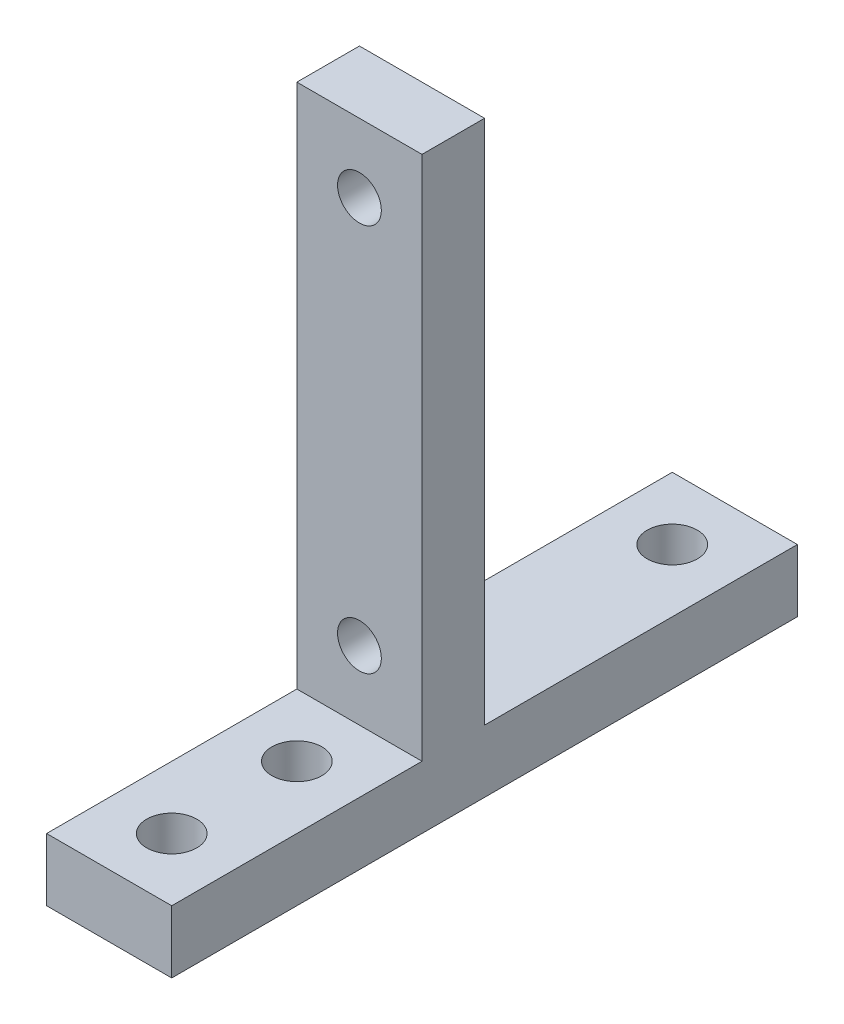
ISO-10303-21;
HEADER;
FILE_DESCRIPTION(('STEP AP214'),'2;1');
FILE_NAME('part.step','',(''),(''),'','','');
FILE_SCHEMA(('AUTOMOTIVE_DESIGN { 1 0 10303 214 1 1 1 1 }'));
ENDSEC;
DATA;
#1=APPLICATION_CONTEXT('core data for automotive mechanical design processes');
#2=APPLICATION_PROTOCOL_DEFINITION('international standard','automotive_design',2000,#1);
#3=PRODUCT_CONTEXT('',#1,'mechanical');
#4=PRODUCT('Part','Part','',(#3));
#5=PRODUCT_RELATED_PRODUCT_CATEGORY('part','',(#4));
#6=PRODUCT_DEFINITION_FORMATION('','',#4);
#7=PRODUCT_DEFINITION_CONTEXT('part definition',#1,'design');
#8=PRODUCT_DEFINITION('design','',#6,#7);
#9=PRODUCT_DEFINITION_SHAPE('','',#8);
#10=(LENGTH_UNIT() NAMED_UNIT(*) SI_UNIT(.MILLI.,.METRE.));
#11=(NAMED_UNIT(*) PLANE_ANGLE_UNIT() SI_UNIT($,.RADIAN.));
#12=(NAMED_UNIT(*) SI_UNIT($,.STERADIAN.) SOLID_ANGLE_UNIT());
#13=UNCERTAINTY_MEASURE_WITH_UNIT(LENGTH_MEASURE(1.E-05),#10,'distance_accuracy_value','');
#14=(GEOMETRIC_REPRESENTATION_CONTEXT(3) GLOBAL_UNCERTAINTY_ASSIGNED_CONTEXT((#13)) GLOBAL_UNIT_ASSIGNED_CONTEXT((#10,
#11,#12)) REPRESENTATION_CONTEXT('',''));
#15=CARTESIAN_POINT('',(0.,0.,0.));
#16=DIRECTION('',(0.,0.,1.));
#17=DIRECTION('',(1.,0.,0.));
#18=AXIS2_PLACEMENT_3D('',#15,#16,#17);
#19=CARTESIAN_POINT('',(0.,0.,5.));
#20=DIRECTION('',(0.,0.,1.));
#21=DIRECTION('',(1.,0.,0.));
#22=AXIS2_PLACEMENT_3D('',#19,#20,#21);
#23=PLANE('',#22);
#24=CARTESIAN_POINT('',(0.,15.5,5.));
#25=DIRECTION('',(0.,0.,1.));
#26=DIRECTION('',(1.,0.,0.));
#27=AXIS2_PLACEMENT_3D('',#24,#25,#26);
#28=CIRCLE('',#27,1.75);
#29=CARTESIAN_POINT('',(1.75,15.5,5.));
#30=VERTEX_POINT('',#29);
#31=EDGE_CURVE('E109',#30,#30,#28,.T.);
#32=ORIENTED_EDGE('',*,*,#31,.F.);
#33=EDGE_LOOP('',(#32));
#34=FACE_BOUND('',#33,.T.);
#35=DIRECTION('',(0.,-1.,0.));
#36=VECTOR('',#35,1.);
#37=CARTESIAN_POINT('',(-4.99999999999999,21.,5.));
#38=LINE('',#37,#36);
#39=CARTESIAN_POINT('',(-4.99999999999999,21.,5.));
#40=VERTEX_POINT('',#39);
#41=CARTESIAN_POINT('',(-4.99999999999999,-21.,5.));
#42=VERTEX_POINT('',#41);
#43=EDGE_CURVE('E99',#40,#42,#38,.T.);
#44=ORIENTED_EDGE('',*,*,#43,.T.);
#45=DIRECTION('',(1.,0.,0.));
#46=VECTOR('',#45,1.);
#47=CARTESIAN_POINT('',(-5.,-21.,5.));
#48=LINE('',#47,#46);
#49=CARTESIAN_POINT('',(5.00000000000001,-21.,5.));
#50=VERTEX_POINT('',#49);
#51=EDGE_CURVE('E85',#42,#50,#48,.T.);
#52=ORIENTED_EDGE('',*,*,#51,.T.);
#53=DIRECTION('',(0.,1.,0.));
#54=VECTOR('',#53,1.);
#55=CARTESIAN_POINT('',(5.00000000000001,-21.,5.));
#56=LINE('',#55,#54);
#57=CARTESIAN_POINT('',(5.00000000000001,21.,5.));
#58=VERTEX_POINT('',#57);
#59=EDGE_CURVE('E97',#50,#58,#56,.T.);
#60=ORIENTED_EDGE('',*,*,#59,.T.);
#61=DIRECTION('',(-1.,0.,0.));
#62=VECTOR('',#61,1.);
#63=CARTESIAN_POINT('',(-4.99999999999999,21.,5.));
#64=LINE('',#63,#62);
#65=EDGE_CURVE('E50',#58,#40,#64,.T.);
#66=ORIENTED_EDGE('',*,*,#65,.T.);
#67=EDGE_LOOP('',(#44,#52,#60,#66));
#68=FACE_BOUND('',#67,.T.);
#69=CARTESIAN_POINT('',(0.,-15.5,5.));
#70=DIRECTION('',(0.,0.,1.));
#71=DIRECTION('',(1.,0.,0.));
#72=AXIS2_PLACEMENT_3D('',#69,#70,#71);
#73=CIRCLE('',#72,1.75);
#74=CARTESIAN_POINT('',(1.75,-15.5,5.));
#75=VERTEX_POINT('',#74);
#76=EDGE_CURVE('E226',#75,#75,#73,.T.);
#77=ORIENTED_EDGE('',*,*,#76,.F.);
#78=EDGE_LOOP('',(#77));
#79=FACE_BOUND('',#78,.T.);
#80=ADVANCED_FACE('F33',(#34,#68,#79),#23,.T.);
#81=CARTESIAN_POINT('',(0.,0.,0.));
#82=DIRECTION('',(0.,0.,1.));
#83=DIRECTION('',(1.,0.,0.));
#84=AXIS2_PLACEMENT_3D('',#81,#82,#83);
#85=PLANE('',#84);
#86=DIRECTION('',(0.,-1.,0.));
#87=VECTOR('',#86,1.);
#88=CARTESIAN_POINT('',(-4.99999999999999,21.,0.));
#89=LINE('',#88,#87);
#90=CARTESIAN_POINT('',(-4.99999999999999,21.,0.));
#91=VERTEX_POINT('',#90);
#92=CARTESIAN_POINT('',(-4.99999999999999,-21.,0.));
#93=VERTEX_POINT('',#92);
#94=EDGE_CURVE('E106',#91,#93,#89,.T.);
#95=ORIENTED_EDGE('',*,*,#94,.F.);
#96=DIRECTION('',(-1.,0.,0.));
#97=VECTOR('',#96,1.);
#98=CARTESIAN_POINT('',(-4.99999999999999,21.,0.));
#99=LINE('',#98,#97);
#100=CARTESIAN_POINT('',(5.00000000000001,21.,0.));
#101=VERTEX_POINT('',#100);
#102=EDGE_CURVE('E112',#101,#91,#99,.T.);
#103=ORIENTED_EDGE('',*,*,#102,.F.);
#104=DIRECTION('',(0.,1.,0.));
#105=VECTOR('',#104,1.);
#106=CARTESIAN_POINT('',(5.00000000000001,-21.,0.));
#107=LINE('',#106,#105);
#108=CARTESIAN_POINT('',(5.00000000000001,-21.,0.));
#109=VERTEX_POINT('',#108);
#110=EDGE_CURVE('E62',#109,#101,#107,.T.);
#111=ORIENTED_EDGE('',*,*,#110,.F.);
#112=DIRECTION('',(1.,0.,0.));
#113=VECTOR('',#112,1.);
#114=CARTESIAN_POINT('',(-5.,-21.,0.));
#115=LINE('',#114,#113);
#116=EDGE_CURVE('E71',#93,#109,#115,.T.);
#117=ORIENTED_EDGE('',*,*,#116,.F.);
#118=EDGE_LOOP('',(#95,#103,#111,#117));
#119=FACE_BOUND('',#118,.T.);
#120=CARTESIAN_POINT('',(0.,15.5,0.));
#121=DIRECTION('',(0.,0.,1.));
#122=DIRECTION('',(1.,0.,0.));
#123=AXIS2_PLACEMENT_3D('',#120,#121,#122);
#124=CIRCLE('',#123,1.75);
#125=CARTESIAN_POINT('',(1.75,15.5,0.));
#126=VERTEX_POINT('',#125);
#127=EDGE_CURVE('E229',#126,#126,#124,.T.);
#128=ORIENTED_EDGE('',*,*,#127,.T.);
#129=EDGE_LOOP('',(#128));
#130=FACE_BOUND('',#129,.T.);
#131=CARTESIAN_POINT('',(0.,-15.5,0.));
#132=DIRECTION('',(0.,0.,1.));
#133=DIRECTION('',(1.,0.,0.));
#134=AXIS2_PLACEMENT_3D('',#131,#132,#133);
#135=CIRCLE('',#134,1.75);
#136=CARTESIAN_POINT('',(1.75,-15.5,0.));
#137=VERTEX_POINT('',#136);
#138=EDGE_CURVE('E225',#137,#137,#135,.T.);
#139=ORIENTED_EDGE('',*,*,#138,.T.);
#140=EDGE_LOOP('',(#139));
#141=FACE_BOUND('',#140,.T.);
#142=ADVANCED_FACE('F120',(#119,#130,#141),#85,.F.);
#143=CARTESIAN_POINT('',(-4.99999999999999,21.,5.));
#144=DIRECTION('',(1.,0.,0.));
#145=DIRECTION('',(0.,1.,0.));
#146=AXIS2_PLACEMENT_3D('',#143,#144,#145);
#147=PLANE('',#146);
#148=ORIENTED_EDGE('',*,*,#94,.T.);
#149=DIRECTION('',(0.,0.,-1.));
#150=VECTOR('',#149,1.);
#151=CARTESIAN_POINT('',(-5.,-21.,25.));
#152=LINE('',#151,#150);
#153=CARTESIAN_POINT('',(-4.99999999999999,-21.,-25.));
#154=VERTEX_POINT('',#153);
#155=EDGE_CURVE('E194',#93,#154,#152,.T.);
#156=ORIENTED_EDGE('',*,*,#155,.T.);
#157=DIRECTION('',(0.,1.,0.));
#158=VECTOR('',#157,1.);
#159=CARTESIAN_POINT('',(-4.99999999999999,-26.,-25.));
#160=LINE('',#159,#158);
#161=CARTESIAN_POINT('',(-4.99999999999999,-26.,-25.));
#162=VERTEX_POINT('',#161);
#163=EDGE_CURVE('E222',#162,#154,#160,.T.);
#164=ORIENTED_EDGE('',*,*,#163,.F.);
#165=DIRECTION('',(0.,0.,-1.));
#166=VECTOR('',#165,1.);
#167=CARTESIAN_POINT('',(-5.,-26.,25.));
#168=LINE('',#167,#166);
#169=CARTESIAN_POINT('',(-5.,-26.,25.));
#170=VERTEX_POINT('',#169);
#171=EDGE_CURVE('E197',#170,#162,#168,.T.);
#172=ORIENTED_EDGE('',*,*,#171,.F.);
#173=DIRECTION('',(0.,1.,0.));
#174=VECTOR('',#173,1.);
#175=CARTESIAN_POINT('',(-5.,-26.,25.));
#176=LINE('',#175,#174);
#177=CARTESIAN_POINT('',(-5.,-21.,25.));
#178=VERTEX_POINT('',#177);
#179=EDGE_CURVE('E209',#170,#178,#176,.T.);
#180=ORIENTED_EDGE('',*,*,#179,.T.);
#181=EDGE_CURVE('E210',#178,#42,#152,.T.);
#182=ORIENTED_EDGE('',*,*,#181,.T.);
#183=ORIENTED_EDGE('',*,*,#43,.F.);
#184=DIRECTION('',(0.,0.,-1.));
#185=VECTOR('',#184,1.);
#186=CARTESIAN_POINT('',(-4.99999999999999,21.,5.));
#187=LINE('',#186,#185);
#188=EDGE_CURVE('E42',#40,#91,#187,.T.);
#189=ORIENTED_EDGE('',*,*,#188,.T.);
#190=EDGE_LOOP('',(#148,#156,#164,#172,#180,#182,#183,#189));
#191=FACE_BOUND('',#190,.T.);
#192=ADVANCED_FACE('F35',(#191),#147,.F.);
#193=CARTESIAN_POINT('',(5.00000000000001,-21.,5.));
#194=DIRECTION('',(-1.,0.,0.));
#195=DIRECTION('',(0.,-1.,0.));
#196=AXIS2_PLACEMENT_3D('',#193,#194,#195);
#197=PLANE('',#196);
#198=ORIENTED_EDGE('',*,*,#110,.T.);
#199=DIRECTION('',(0.,0.,-1.));
#200=VECTOR('',#199,1.);
#201=CARTESIAN_POINT('',(5.00000000000001,21.,5.));
#202=LINE('',#201,#200);
#203=EDGE_CURVE('E11',#58,#101,#202,.T.);
#204=ORIENTED_EDGE('',*,*,#203,.F.);
#205=ORIENTED_EDGE('',*,*,#59,.F.);
#206=DIRECTION('',(0.,0.,1.));
#207=VECTOR('',#206,1.);
#208=CARTESIAN_POINT('',(5.00000000000001,-21.,25.));
#209=LINE('',#208,#207);
#210=CARTESIAN_POINT('',(5.00000000000001,-21.,25.));
#211=VERTEX_POINT('',#210);
#212=EDGE_CURVE('E80',#50,#211,#209,.T.);
#213=ORIENTED_EDGE('',*,*,#212,.T.);
#214=DIRECTION('',(0.,1.,0.));
#215=VECTOR('',#214,1.);
#216=CARTESIAN_POINT('',(5.00000000000001,-26.,25.));
#217=LINE('',#216,#215);
#218=CARTESIAN_POINT('',(5.00000000000001,-26.,25.));
#219=VERTEX_POINT('',#218);
#220=EDGE_CURVE('E217',#219,#211,#217,.T.);
#221=ORIENTED_EDGE('',*,*,#220,.F.);
#222=DIRECTION('',(0.,0.,1.));
#223=VECTOR('',#222,1.);
#224=CARTESIAN_POINT('',(5.00000000000001,-26.,25.));
#225=LINE('',#224,#223);
#226=CARTESIAN_POINT('',(5.00000000000001,-26.,-25.));
#227=VERTEX_POINT('',#226);
#228=EDGE_CURVE('E203',#227,#219,#225,.T.);
#229=ORIENTED_EDGE('',*,*,#228,.F.);
#230=DIRECTION('',(0.,1.,0.));
#231=VECTOR('',#230,1.);
#232=CARTESIAN_POINT('',(5.00000000000001,-26.,-25.));
#233=LINE('',#232,#231);
#234=CARTESIAN_POINT('',(5.00000000000001,-21.,-25.));
#235=VERTEX_POINT('',#234);
#236=EDGE_CURVE('E219',#227,#235,#233,.T.);
#237=ORIENTED_EDGE('',*,*,#236,.T.);
#238=EDGE_CURVE('E93',#235,#109,#209,.T.);
#239=ORIENTED_EDGE('',*,*,#238,.T.);
#240=EDGE_LOOP('',(#198,#204,#205,#213,#221,#229,#237,#239));
#241=FACE_BOUND('',#240,.T.);
#242=ADVANCED_FACE('F101',(#241),#197,.F.);
#243=CARTESIAN_POINT('',(-4.99999999999999,21.,5.));
#244=DIRECTION('',(0.,-1.,0.));
#245=DIRECTION('',(0.,0.,-1.));
#246=AXIS2_PLACEMENT_3D('',#243,#244,#245);
#247=PLANE('',#246);
#248=ORIENTED_EDGE('',*,*,#102,.T.);
#249=ORIENTED_EDGE('',*,*,#188,.F.);
#250=ORIENTED_EDGE('',*,*,#65,.F.);
#251=ORIENTED_EDGE('',*,*,#203,.T.);
#252=EDGE_LOOP('',(#248,#249,#250,#251));
#253=FACE_BOUND('',#252,.T.);
#254=ADVANCED_FACE('F122',(#253),#247,.F.);
#255=CARTESIAN_POINT('',(0.,15.5,5.));
#256=DIRECTION('',(0.,0.,-1.));
#257=DIRECTION('',(-1.,0.,0.));
#258=AXIS2_PLACEMENT_3D('',#255,#256,#257);
#259=CYLINDRICAL_SURFACE('',#258,1.75);
#260=ORIENTED_EDGE('',*,*,#31,.T.);
#261=EDGE_LOOP('',(#260));
#262=FACE_BOUND('',#261,.T.);
#263=ORIENTED_EDGE('',*,*,#127,.F.);
#264=EDGE_LOOP('',(#263));
#265=FACE_BOUND('',#264,.T.);
#266=ADVANCED_FACE('F124',(#262,#265),#259,.F.);
#267=CARTESIAN_POINT('',(0.,-15.5,5.));
#268=DIRECTION('',(0.,0.,-1.));
#269=DIRECTION('',(-1.,0.,0.));
#270=AXIS2_PLACEMENT_3D('',#267,#268,#269);
#271=CYLINDRICAL_SURFACE('',#270,1.75);
#272=ORIENTED_EDGE('',*,*,#76,.T.);
#273=EDGE_LOOP('',(#272));
#274=FACE_BOUND('',#273,.T.);
#275=ORIENTED_EDGE('',*,*,#138,.F.);
#276=EDGE_LOOP('',(#275));
#277=FACE_BOUND('',#276,.T.);
#278=ADVANCED_FACE('F130',(#274,#277),#271,.F.);
#279=CARTESIAN_POINT('',(0.,-21.,0.));
#280=DIRECTION('',(0.,-1.,0.));
#281=DIRECTION('',(0.,0.,-1.));
#282=AXIS2_PLACEMENT_3D('',#279,#280,#281);
#283=PLANE('',#282);
#284=CARTESIAN_POINT('',(0.,-21.,-20.));
#285=DIRECTION('',(0.,-1.,0.));
#286=DIRECTION('',(0.,0.,-1.));
#287=AXIS2_PLACEMENT_3D('',#284,#285,#286);
#288=CIRCLE('',#287,2.);
#289=CARTESIAN_POINT('',(0.,-21.,-22.));
#290=VERTEX_POINT('',#289);
#291=EDGE_CURVE('E182',#290,#290,#288,.T.);
#292=ORIENTED_EDGE('',*,*,#291,.T.);
#293=EDGE_LOOP('',(#292));
#294=FACE_BOUND('',#293,.T.);
#295=ORIENTED_EDGE('',*,*,#155,.F.);
#296=ORIENTED_EDGE('',*,*,#116,.T.);
#297=ORIENTED_EDGE('',*,*,#238,.F.);
#298=DIRECTION('',(1.,0.,0.));
#299=VECTOR('',#298,1.);
#300=CARTESIAN_POINT('',(-4.99999999999999,-21.,-25.));
#301=LINE('',#300,#299);
#302=EDGE_CURVE('E94',#154,#235,#301,.T.);
#303=ORIENTED_EDGE('',*,*,#302,.F.);
#304=EDGE_LOOP('',(#295,#296,#297,#303));
#305=FACE_BOUND('',#304,.T.);
#306=ADVANCED_FACE('F144',(#294,#305),#283,.F.);
#307=CARTESIAN_POINT('',(0.,-26.,0.));
#308=DIRECTION('',(0.,-1.,0.));
#309=DIRECTION('',(0.,0.,-1.));
#310=AXIS2_PLACEMENT_3D('',#307,#308,#309);
#311=PLANE('',#310);
#312=CARTESIAN_POINT('',(0.,-26.,-20.));
#313=DIRECTION('',(0.,-1.,0.));
#314=DIRECTION('',(0.,0.,-1.));
#315=AXIS2_PLACEMENT_3D('',#312,#313,#314);
#316=CIRCLE('',#315,2.);
#317=CARTESIAN_POINT('',(0.,-26.,-22.));
#318=VERTEX_POINT('',#317);
#319=EDGE_CURVE('E185',#318,#318,#316,.T.);
#320=ORIENTED_EDGE('',*,*,#319,.F.);
#321=EDGE_LOOP('',(#320));
#322=FACE_BOUND('',#321,.T.);
#323=ORIENTED_EDGE('',*,*,#171,.T.);
#324=DIRECTION('',(1.,0.,0.));
#325=VECTOR('',#324,1.);
#326=CARTESIAN_POINT('',(-4.99999999999999,-26.,-25.));
#327=LINE('',#326,#325);
#328=EDGE_CURVE('E200',#162,#227,#327,.T.);
#329=ORIENTED_EDGE('',*,*,#328,.T.);
#330=ORIENTED_EDGE('',*,*,#228,.T.);
#331=DIRECTION('',(-1.,0.,0.));
#332=VECTOR('',#331,1.);
#333=CARTESIAN_POINT('',(-5.,-26.,25.));
#334=LINE('',#333,#332);
#335=EDGE_CURVE('E206',#219,#170,#334,.T.);
#336=ORIENTED_EDGE('',*,*,#335,.T.);
#337=EDGE_LOOP('',(#323,#329,#330,#336));
#338=FACE_BOUND('',#337,.T.);
#339=CARTESIAN_POINT('',(0.,-26.,20.));
#340=DIRECTION('',(0.,-1.,0.));
#341=DIRECTION('',(0.,0.,-1.));
#342=AXIS2_PLACEMENT_3D('',#339,#340,#341);
#343=CIRCLE('',#342,2.);
#344=CARTESIAN_POINT('',(0.,-26.,18.));
#345=VERTEX_POINT('',#344);
#346=EDGE_CURVE('E191',#345,#345,#343,.T.);
#347=ORIENTED_EDGE('',*,*,#346,.F.);
#348=EDGE_LOOP('',(#347));
#349=FACE_BOUND('',#348,.T.);
#350=CARTESIAN_POINT('',(0.,-26.,10.));
#351=DIRECTION('',(0.,-1.,0.));
#352=DIRECTION('',(0.,0.,-1.));
#353=AXIS2_PLACEMENT_3D('',#350,#351,#352);
#354=CIRCLE('',#353,2.);
#355=CARTESIAN_POINT('',(0.,-26.,8.));
#356=VERTEX_POINT('',#355);
#357=EDGE_CURVE('E176',#356,#356,#354,.T.);
#358=ORIENTED_EDGE('',*,*,#357,.F.);
#359=EDGE_LOOP('',(#358));
#360=FACE_BOUND('',#359,.T.);
#361=ADVANCED_FACE('F157',(#322,#338,#349,#360),#311,.T.);
#362=ORIENTED_EDGE('',*,*,#51,.F.);
#363=ORIENTED_EDGE('',*,*,#181,.F.);
#364=DIRECTION('',(-1.,0.,0.));
#365=VECTOR('',#364,1.);
#366=CARTESIAN_POINT('',(-5.,-21.,25.));
#367=LINE('',#366,#365);
#368=EDGE_CURVE('E89',#211,#178,#367,.T.);
#369=ORIENTED_EDGE('',*,*,#368,.F.);
#370=ORIENTED_EDGE('',*,*,#212,.F.);
#371=EDGE_LOOP('',(#362,#363,#369,#370));
#372=FACE_BOUND('',#371,.T.);
#373=CARTESIAN_POINT('',(0.,-21.,20.));
#374=DIRECTION('',(0.,-1.,0.));
#375=DIRECTION('',(0.,0.,-1.));
#376=AXIS2_PLACEMENT_3D('',#373,#374,#375);
#377=CIRCLE('',#376,2.);
#378=CARTESIAN_POINT('',(0.,-21.,18.));
#379=VERTEX_POINT('',#378);
#380=EDGE_CURVE('E188',#379,#379,#377,.T.);
#381=ORIENTED_EDGE('',*,*,#380,.T.);
#382=EDGE_LOOP('',(#381));
#383=FACE_BOUND('',#382,.T.);
#384=CARTESIAN_POINT('',(0.,-21.,10.));
#385=DIRECTION('',(0.,-1.,0.));
#386=DIRECTION('',(0.,0.,-1.));
#387=AXIS2_PLACEMENT_3D('',#384,#385,#386);
#388=CIRCLE('',#387,2.);
#389=CARTESIAN_POINT('',(0.,-21.,8.));
#390=VERTEX_POINT('',#389);
#391=EDGE_CURVE('E179',#390,#390,#388,.T.);
#392=ORIENTED_EDGE('',*,*,#391,.T.);
#393=EDGE_LOOP('',(#392));
#394=FACE_BOUND('',#393,.T.);
#395=ADVANCED_FACE('F82',(#372,#383,#394),#283,.F.);
#396=CARTESIAN_POINT('',(-4.99999999999999,-26.,-25.));
#397=DIRECTION('',(0.,0.,1.));
#398=DIRECTION('',(1.,0.,0.));
#399=AXIS2_PLACEMENT_3D('',#396,#397,#398);
#400=PLANE('',#399);
#401=ORIENTED_EDGE('',*,*,#302,.T.);
#402=ORIENTED_EDGE('',*,*,#236,.F.);
#403=ORIENTED_EDGE('',*,*,#328,.F.);
#404=ORIENTED_EDGE('',*,*,#163,.T.);
#405=EDGE_LOOP('',(#401,#402,#403,#404));
#406=FACE_BOUND('',#405,.T.);
#407=ADVANCED_FACE('F146',(#406),#400,.F.);
#408=CARTESIAN_POINT('',(-5.,-26.,25.));
#409=DIRECTION('',(0.,0.,-1.));
#410=DIRECTION('',(-1.,0.,0.));
#411=AXIS2_PLACEMENT_3D('',#408,#409,#410);
#412=PLANE('',#411);
#413=ORIENTED_EDGE('',*,*,#368,.T.);
#414=ORIENTED_EDGE('',*,*,#179,.F.);
#415=ORIENTED_EDGE('',*,*,#335,.F.);
#416=ORIENTED_EDGE('',*,*,#220,.T.);
#417=EDGE_LOOP('',(#413,#414,#415,#416));
#418=FACE_BOUND('',#417,.T.);
#419=ADVANCED_FACE('F149',(#418),#412,.F.);
#420=CARTESIAN_POINT('',(0.,-26.,20.));
#421=DIRECTION('',(0.,1.,0.));
#422=DIRECTION('',(0.,0.,1.));
#423=AXIS2_PLACEMENT_3D('',#420,#421,#422);
#424=CYLINDRICAL_SURFACE('',#423,2.);
#425=ORIENTED_EDGE('',*,*,#346,.T.);
#426=EDGE_LOOP('',(#425));
#427=FACE_BOUND('',#426,.T.);
#428=ORIENTED_EDGE('',*,*,#380,.F.);
#429=EDGE_LOOP('',(#428));
#430=FACE_BOUND('',#429,.T.);
#431=ADVANCED_FACE('F153',(#427,#430),#424,.F.);
#432=CARTESIAN_POINT('',(0.,-26.,-20.));
#433=DIRECTION('',(0.,1.,0.));
#434=DIRECTION('',(0.,0.,1.));
#435=AXIS2_PLACEMENT_3D('',#432,#433,#434);
#436=CYLINDRICAL_SURFACE('',#435,2.);
#437=ORIENTED_EDGE('',*,*,#319,.T.);
#438=EDGE_LOOP('',(#437));
#439=FACE_BOUND('',#438,.T.);
#440=ORIENTED_EDGE('',*,*,#291,.F.);
#441=EDGE_LOOP('',(#440));
#442=FACE_BOUND('',#441,.T.);
#443=ADVANCED_FACE('F163',(#439,#442),#436,.F.);
#444=CARTESIAN_POINT('',(0.,-26.,10.));
#445=DIRECTION('',(0.,1.,0.));
#446=DIRECTION('',(0.,0.,1.));
#447=AXIS2_PLACEMENT_3D('',#444,#445,#446);
#448=CYLINDRICAL_SURFACE('',#447,2.);
#449=ORIENTED_EDGE('',*,*,#357,.T.);
#450=EDGE_LOOP('',(#449));
#451=FACE_BOUND('',#450,.T.);
#452=ORIENTED_EDGE('',*,*,#391,.F.);
#453=EDGE_LOOP('',(#452));
#454=FACE_BOUND('',#453,.T.);
#455=ADVANCED_FACE('F167',(#451,#454),#448,.F.);
#456=CLOSED_SHELL('',(#80,#142,#192,#242,#254,#266,#278,#306,#361,#395,#407,#419,#431,#443,#455));
#457=MANIFOLD_SOLID_BREP('B2',#456);
#458=ADVANCED_BREP_SHAPE_REPRESENTATION('',(#18,#457),#14);
#459=SHAPE_DEFINITION_REPRESENTATION(#9,#458);
ENDSEC;
END-ISO-10303-21;
